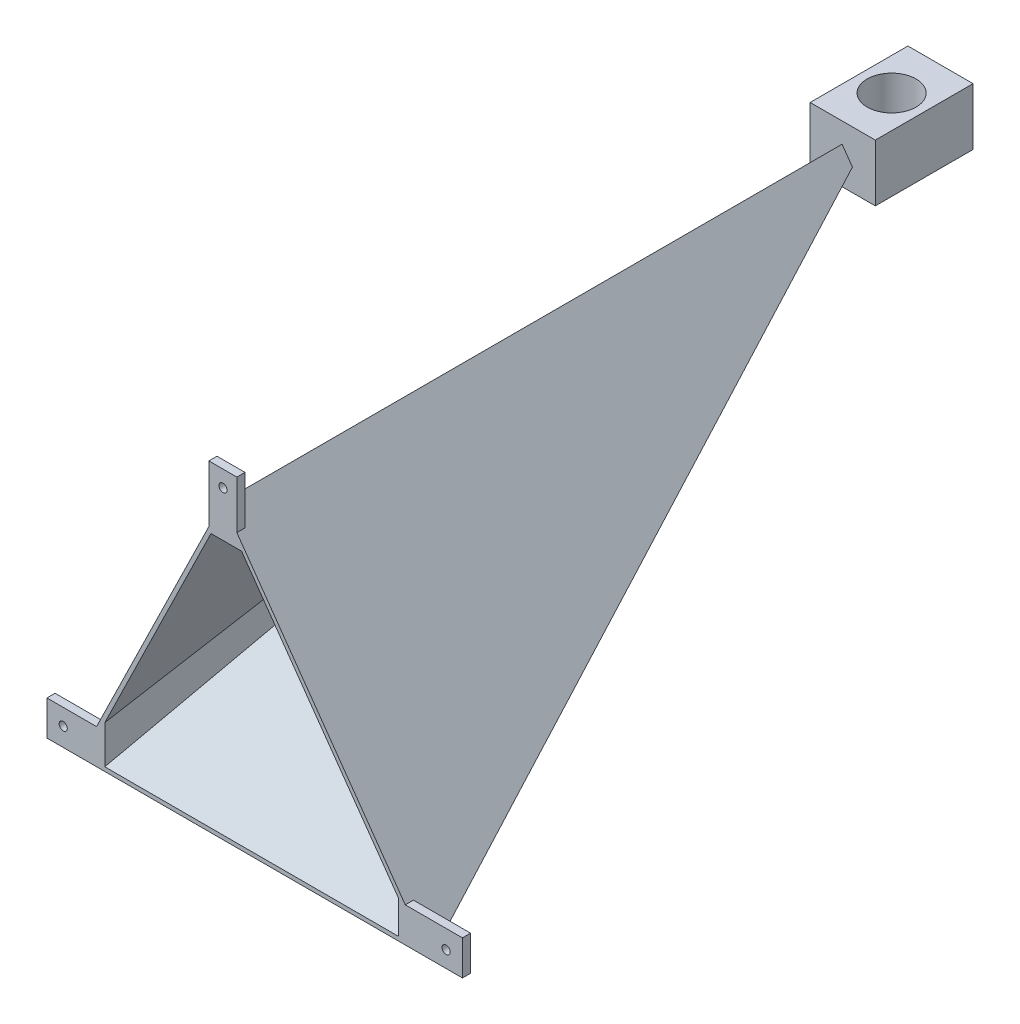
ISO-10303-21;
HEADER;
FILE_DESCRIPTION(('STEP AP214'),'2;1');
FILE_NAME('part.step','',(''),(''),'','','');
FILE_SCHEMA(('AUTOMOTIVE_DESIGN { 1 0 10303 214 1 1 1 1 }'));
ENDSEC;
DATA;
#1=APPLICATION_CONTEXT('core data for automotive mechanical design processes');
#2=APPLICATION_PROTOCOL_DEFINITION('international standard','automotive_design',2000,#1);
#3=PRODUCT_CONTEXT('',#1,'mechanical');
#4=PRODUCT('Part','Part','',(#3));
#5=PRODUCT_RELATED_PRODUCT_CATEGORY('part','',(#4));
#6=PRODUCT_DEFINITION_FORMATION('','',#4);
#7=PRODUCT_DEFINITION_CONTEXT('part definition',#1,'design');
#8=PRODUCT_DEFINITION('design','',#6,#7);
#9=PRODUCT_DEFINITION_SHAPE('','',#8);
#10=(LENGTH_UNIT() NAMED_UNIT(*) SI_UNIT(.MILLI.,.METRE.));
#11=(NAMED_UNIT(*) PLANE_ANGLE_UNIT() SI_UNIT($,.RADIAN.));
#12=(NAMED_UNIT(*) SI_UNIT($,.STERADIAN.) SOLID_ANGLE_UNIT());
#13=UNCERTAINTY_MEASURE_WITH_UNIT(LENGTH_MEASURE(1.E-05),#10,'distance_accuracy_value','');
#14=(GEOMETRIC_REPRESENTATION_CONTEXT(3) GLOBAL_UNCERTAINTY_ASSIGNED_CONTEXT((#13)) GLOBAL_UNIT_ASSIGNED_CONTEXT((#10,
#11,#12)) REPRESENTATION_CONTEXT('',''));
#15=CARTESIAN_POINT('',(0.,0.,0.));
#16=DIRECTION('',(0.,0.,1.));
#17=DIRECTION('',(1.,0.,0.));
#18=AXIS2_PLACEMENT_3D('',#15,#16,#17);
#19=CARTESIAN_POINT('',(-8.76166702832854,4.29092230853839,0.));
#20=DIRECTION('',(0.898083213266033,-0.439825581395349,0.));
#21=DIRECTION('',(0.439825581395349,0.898083213266033,0.));
#22=AXIS2_PLACEMENT_3D('',#19,#20,#21);
#23=PLANE('',#22);
#24=DIRECTION('',(-0.439825581395349,-0.898083213266033,0.));
#25=VECTOR('',#24,1.);
#26=CARTESIAN_POINT('',(77.1020210409745,179.616642653207,0.));
#27=LINE('',#26,#25);
#28=CARTESIAN_POINT('',(68.5139513556418,162.080597582142,0.));
#29=VERTEX_POINT('',#28);
#30=CARTESIAN_POINT('',(-0.414869497190093,21.3343119255414,0.));
#31=VERTEX_POINT('',#30);
#32=EDGE_CURVE('E306',#29,#31,#27,.T.);
#33=ORIENTED_EDGE('',*,*,#32,.F.);
#34=DIRECTION('',(0.,0.,-1.));
#35=VECTOR('',#34,1.);
#36=CARTESIAN_POINT('',(68.5139513556418,162.080597582142,0.));
#37=LINE('',#36,#35);
#38=CARTESIAN_POINT('',(68.5139513556418,162.080597582142,-5.));
#39=VERTEX_POINT('',#38);
#40=EDGE_CURVE('E417',#29,#39,#37,.T.);
#41=ORIENTED_EDGE('',*,*,#40,.T.);
#42=DIRECTION('',(-0.439825581395349,-0.898083213266033,0.));
#43=VECTOR('',#42,1.);
#44=CARTESIAN_POINT('',(-8.76166702832854,4.29092230853839,-5.));
#45=LINE('',#44,#43);
#46=CARTESIAN_POINT('',(77.1020210409745,179.616642653207,-5.));
#47=VERTEX_POINT('',#46);
#48=EDGE_CURVE('E416',#47,#39,#45,.T.);
#49=ORIENTED_EDGE('',*,*,#48,.F.);
#50=DIRECTION('',(0.,0.,1.));
#51=VECTOR('',#50,1.);
#52=CARTESIAN_POINT('',(77.1020210409745,179.616642653207,-399.999999999999));
#53=LINE('',#52,#51);
#54=CARTESIAN_POINT('',(77.1020210409745,179.616642653207,-379.999999999999));
#55=VERTEX_POINT('',#54);
#56=EDGE_CURVE('E335',#55,#47,#53,.T.);
#57=ORIENTED_EDGE('',*,*,#56,.F.);
#58=DIRECTION('',(0.439825581395349,0.898083213266033,0.));
#59=VECTOR('',#58,1.);
#60=CARTESIAN_POINT('',(-8.76166702832853,4.29092230853838,-379.999999999999));
#61=LINE('',#60,#59);
#62=CARTESIAN_POINT('',(72.703765227021,170.635810520546,-379.999999999999));
#63=VERTEX_POINT('',#62);
#64=EDGE_CURVE('E384',#63,#55,#61,.T.);
#65=ORIENTED_EDGE('',*,*,#64,.F.);
#66=DIRECTION('',(-0.196695979648674,-0.401635022862859,0.894427190999915));
#67=VECTOR('',#66,1.);
#68=CARTESIAN_POINT('',(77.1020210409745,179.616642653207,-399.999999999999));
#69=LINE('',#68,#67);
#70=CARTESIAN_POINT('',(-9.76353128460688,2.24520803316507,-4.99999999999995));
#71=VERTEX_POINT('',#70);
#72=EDGE_CURVE('E331',#63,#71,#69,.T.);
#73=ORIENTED_EDGE('',*,*,#72,.T.);
#74=DIRECTION('',(0.439825581395349,0.898083213266033,0.));
#75=VECTOR('',#74,1.);
#76=CARTESIAN_POINT('',(-8.76166702832854,4.29092230853839,-5.));
#77=LINE('',#76,#75);
#78=CARTESIAN_POINT('',(-0.414869497190087,21.3343119255414,-5.));
#79=VERTEX_POINT('',#78);
#80=EDGE_CURVE('E517',#71,#79,#77,.T.);
#81=ORIENTED_EDGE('',*,*,#80,.T.);
#82=DIRECTION('',(0.,0.,1.));
#83=VECTOR('',#82,1.);
#84=CARTESIAN_POINT('',(-0.414869497190088,21.3343119255414,0.));
#85=LINE('',#84,#83);
#86=EDGE_CURVE('E368',#79,#31,#85,.T.);
#87=ORIENTED_EDGE('',*,*,#86,.T.);
#88=EDGE_LOOP('',(#33,#41,#49,#57,#65,#73,#81,#87));
#89=FACE_BOUND('',#88,.T.);
#90=ADVANCED_FACE('F55',(#89),#23,.F.);
#91=CARTESIAN_POINT('',(136.072170604111,96.2378102329994,0.));
#92=DIRECTION('',(-0.816439284787303,-0.577431289640592,0.));
#93=DIRECTION('',(0.577431289640592,-0.816439284787303,0.));
#94=AXIS2_PLACEMENT_3D('',#91,#92,#93);
#95=PLANE('',#94);
#96=DIRECTION('',(-0.577431289640592,0.816439284787303,0.));
#97=VECTOR('',#96,1.);
#98=CARTESIAN_POINT('',(136.072170604111,96.2378102329994,-5.));
#99=LINE('',#98,#97);
#100=CARTESIAN_POINT('',(85.6900907263073,167.47383432711,-5.));
#101=VERTEX_POINT('',#100);
#102=EDGE_CURVE('E314',#101,#47,#99,.T.);
#103=ORIENTED_EDGE('',*,*,#102,.F.);
#104=DIRECTION('',(0.,0.,1.));
#105=VECTOR('',#104,1.);
#106=CARTESIAN_POINT('',(85.6900907263073,167.47383432711,0.));
#107=LINE('',#106,#105);
#108=CARTESIAN_POINT('',(85.6900907263073,167.47383432711,0.));
#109=VERTEX_POINT('',#108);
#110=EDGE_CURVE('E402',#101,#109,#107,.T.);
#111=ORIENTED_EDGE('',*,*,#110,.T.);
#112=DIRECTION('',(-0.577431289640592,0.816439284787303,0.));
#113=VECTOR('',#112,1.);
#114=CARTESIAN_POINT('',(204.136904761905,0.,0.));
#115=LINE('',#114,#113);
#116=CARTESIAN_POINT('',(189.04809230726,21.3343119255414,0.));
#117=VERTEX_POINT('',#116);
#118=EDGE_CURVE('E336',#117,#109,#115,.T.);
#119=ORIENTED_EDGE('',*,*,#118,.F.);
#120=DIRECTION('',(0.,0.,-1.));
#121=VECTOR('',#120,1.);
#122=CARTESIAN_POINT('',(189.04809230726,21.3343119255414,0.));
#123=LINE('',#122,#121);
#124=CARTESIAN_POINT('',(189.04809230726,21.3343119255414,-5.));
#125=VERTEX_POINT('',#124);
#126=EDGE_CURVE('E486',#117,#125,#123,.T.);
#127=ORIENTED_EDGE('',*,*,#126,.T.);
#128=DIRECTION('',(-0.577431289640592,0.816439284787303,0.));
#129=VECTOR('',#128,1.);
#130=CARTESIAN_POINT('',(136.072170604111,96.2378102329994,-5.));
#131=LINE('',#130,#129);
#132=CARTESIAN_POINT('',(202.548968715393,2.24520803316507,-4.99999999999998));
#133=VERTEX_POINT('',#132);
#134=EDGE_CURVE('E494',#133,#125,#131,.T.);
#135=ORIENTED_EDGE('',*,*,#134,.F.);
#136=DIRECTION('',(0.278274965182918,-0.393457399389571,0.876215908676646));
#137=VECTOR('',#136,1.);
#138=CARTESIAN_POINT('',(77.1020210409745,179.616642653207,-399.999999999999));
#139=LINE('',#138,#137);
#140=CARTESIAN_POINT('',(83.4537652270211,170.635810520546,-379.999999999999));
#141=VERTEX_POINT('',#140);
#142=EDGE_CURVE('E293',#141,#133,#139,.T.);
#143=ORIENTED_EDGE('',*,*,#142,.F.);
#144=DIRECTION('',(0.577431289640592,-0.816439284787303,0.));
#145=VECTOR('',#144,1.);
#146=CARTESIAN_POINT('',(136.072170604111,96.2378102329994,-379.999999999999));
#147=LINE('',#146,#145);
#148=EDGE_CURVE('E571',#55,#141,#147,.T.);
#149=ORIENTED_EDGE('',*,*,#148,.F.);
#150=ORIENTED_EDGE('',*,*,#56,.T.);
#151=EDGE_LOOP('',(#103,#111,#119,#127,#135,#143,#149,#150));
#152=FACE_BOUND('',#151,.T.);
#153=ADVANCED_FACE('F387',(#152),#95,.F.);
#154=CARTESIAN_POINT('',(0.,0.,0.));
#155=DIRECTION('',(0.,0.91224839351879,0.409637484274067));
#156=DIRECTION('',(0.,-0.409637484274067,0.91224839351879));
#157=AXIS2_PLACEMENT_3D('',#154,#155,#156);
#158=PLANE('',#157);
#159=DIRECTION('',(1.,0.,0.));
#160=VECTOR('',#159,1.);
#161=CARTESIAN_POINT('',(0.,2.24520803316509,-5.));
#162=LINE('',#161,#160);
#163=CARTESIAN_POINT('',(174.136904761905,2.24520803316508,-5.));
#164=VERTEX_POINT('',#163);
#165=EDGE_CURVE('E356',#164,#133,#162,.T.);
#166=ORIENTED_EDGE('',*,*,#165,.F.);
#167=DIRECTION('',(0.,-0.409637484274067,0.91224839351879));
#168=VECTOR('',#167,1.);
#169=CARTESIAN_POINT('',(174.136904761905,0.,0.));
#170=LINE('',#169,#168);
#171=CARTESIAN_POINT('',(174.136904761905,0.,0.));
#172=VERTEX_POINT('',#171);
#173=EDGE_CURVE('E489',#164,#172,#170,.T.);
#174=ORIENTED_EDGE('',*,*,#173,.T.);
#175=DIRECTION('',(1.,0.,0.));
#176=VECTOR('',#175,1.);
#177=CARTESIAN_POINT('',(-10.8630952380952,0.,0.));
#178=LINE('',#177,#176);
#179=CARTESIAN_POINT('',(19.1369047619048,0.,0.));
#180=VERTEX_POINT('',#179);
#181=EDGE_CURVE('E349',#180,#172,#178,.T.);
#182=ORIENTED_EDGE('',*,*,#181,.F.);
#183=DIRECTION('',(0.,0.409637484274067,-0.91224839351879));
#184=VECTOR('',#183,1.);
#185=CARTESIAN_POINT('',(19.1369047619048,0.,0.));
#186=LINE('',#185,#184);
#187=CARTESIAN_POINT('',(19.1369047619048,2.24520803316508,-5.));
#188=VERTEX_POINT('',#187);
#189=EDGE_CURVE('E512',#180,#188,#186,.T.);
#190=ORIENTED_EDGE('',*,*,#189,.T.);
#191=DIRECTION('',(-1.,0.,0.));
#192=VECTOR('',#191,1.);
#193=CARTESIAN_POINT('',(0.,2.24520803316509,-5.));
#194=LINE('',#193,#192);
#195=EDGE_CURVE('E341',#188,#71,#194,.T.);
#196=ORIENTED_EDGE('',*,*,#195,.T.);
#197=ORIENTED_EDGE('',*,*,#72,.F.);
#198=DIRECTION('',(-1.,0.,0.));
#199=VECTOR('',#198,1.);
#200=CARTESIAN_POINT('',(0.,170.635810520546,-379.999999999999));
#201=LINE('',#200,#199);
#202=EDGE_CURVE('E337',#141,#63,#201,.T.);
#203=ORIENTED_EDGE('',*,*,#202,.F.);
#204=ORIENTED_EDGE('',*,*,#142,.T.);
#205=EDGE_LOOP('',(#166,#174,#182,#190,#196,#197,#203,#204));
#206=FACE_BOUND('',#205,.T.);
#207=ADVANCED_FACE('F57',(#206),#158,.F.);
#208=CARTESIAN_POINT('',(0.,0.,0.));
#209=DIRECTION('',(0.,0.,1.));
#210=DIRECTION('',(1.,0.,0.));
#211=AXIS2_PLACEMENT_3D('',#208,#209,#210);
#212=PLANE('',#211);
#213=DIRECTION('',(-1.,0.,0.));
#214=VECTOR('',#213,1.);
#215=CARTESIAN_POINT('',(88.5716986076385,159.069963659325,0.));
#216=LINE('',#215,#214);
#217=CARTESIAN_POINT('',(88.5716986076385,159.069963659325,0.));
#218=VERTEX_POINT('',#217);
#219=CARTESIAN_POINT('',(69.8232355813792,159.069963659325,0.));
#220=VERTEX_POINT('',#219);
#221=EDGE_CURVE('E682',#218,#220,#216,.T.);
#222=ORIENTED_EDGE('',*,*,#221,.F.);
#223=DIRECTION('',(-0.577431289640592,0.816439284787303,0.));
#224=VECTOR('',#223,1.);
#225=CARTESIAN_POINT('',(184.871981238866,22.9094623377017,0.));
#226=LINE('',#225,#224);
#227=CARTESIAN_POINT('',(184.871981238866,22.9094623377017,0.));
#228=VERTEX_POINT('',#227);
#229=EDGE_CURVE('E677',#228,#218,#226,.T.);
#230=ORIENTED_EDGE('',*,*,#229,.F.);
#231=DIRECTION('',(0.,1.,0.));
#232=VECTOR('',#231,1.);
#233=CARTESIAN_POINT('',(184.871981238866,2.5,0.));
#234=LINE('',#233,#232);
#235=CARTESIAN_POINT('',(184.871981238866,2.5,0.));
#236=VERTEX_POINT('',#235);
#237=EDGE_CURVE('E255',#236,#228,#234,.T.);
#238=ORIENTED_EDGE('',*,*,#237,.F.);
#239=DIRECTION('',(1.,0.,0.));
#240=VECTOR('',#239,1.);
#241=CARTESIAN_POINT('',(4.64946483043279,2.5,0.));
#242=LINE('',#241,#240);
#243=CARTESIAN_POINT('',(4.64946483043279,2.5,0.));
#244=VERTEX_POINT('',#243);
#245=EDGE_CURVE('E232',#244,#236,#242,.T.);
#246=ORIENTED_EDGE('',*,*,#245,.F.);
#247=DIRECTION('',(0.,-1.,0.));
#248=VECTOR('',#247,1.);
#249=CARTESIAN_POINT('',(4.64946483043279,2.5,0.));
#250=LINE('',#249,#248);
#251=CARTESIAN_POINT('',(4.64946483043279,25.9911434802389,0.));
#252=VERTEX_POINT('',#251);
#253=EDGE_CURVE('E242',#252,#244,#250,.T.);
#254=ORIENTED_EDGE('',*,*,#253,.F.);
#255=DIRECTION('',(-0.439825581395349,-0.898083213266033,0.));
#256=VECTOR('',#255,1.);
#257=CARTESIAN_POINT('',(4.64946483043279,25.9911434802389,0.));
#258=LINE('',#257,#256);
#259=EDGE_CURVE('E247',#220,#252,#258,.T.);
#260=ORIENTED_EDGE('',*,*,#259,.F.);
#261=EDGE_LOOP('',(#222,#230,#238,#246,#254,#260));
#262=FACE_BOUND('',#261,.T.);
#263=CARTESIAN_POINT('',(-20.8630952380952,11.3343119255414,0.));
#264=DIRECTION('',(0.,0.,1.));
#265=DIRECTION('',(1.,0.,0.));
#266=AXIS2_PLACEMENT_3D('',#263,#264,#265);
#267=CIRCLE('',#266,2.5);
#268=CARTESIAN_POINT('',(-18.3630952380952,11.3343119255414,0.));
#269=VERTEX_POINT('',#268);
#270=EDGE_CURVE('E657',#269,#269,#267,.T.);
#271=ORIENTED_EDGE('',*,*,#270,.F.);
#272=EDGE_LOOP('',(#271));
#273=FACE_BOUND('',#272,.T.);
#274=CARTESIAN_POINT('',(214.136904761905,10.,0.));
#275=DIRECTION('',(0.,0.,1.));
#276=DIRECTION('',(1.,0.,0.));
#277=AXIS2_PLACEMENT_3D('',#274,#275,#276);
#278=CIRCLE('',#277,2.5);
#279=CARTESIAN_POINT('',(216.636904761905,10.,0.));
#280=VERTEX_POINT('',#279);
#281=EDGE_CURVE('E662',#280,#280,#278,.T.);
#282=ORIENTED_EDGE('',*,*,#281,.F.);
#283=EDGE_LOOP('',(#282));
#284=FACE_BOUND('',#283,.T.);
#285=CARTESIAN_POINT('',(77.1900907263073,187.,0.));
#286=DIRECTION('',(0.,0.,1.));
#287=DIRECTION('',(1.,0.,0.));
#288=AXIS2_PLACEMENT_3D('',#285,#286,#287);
#289=CIRCLE('',#288,2.5);
#290=CARTESIAN_POINT('',(79.6900907263073,187.,0.));
#291=VERTEX_POINT('',#290);
#292=EDGE_CURVE('E450',#291,#291,#289,.T.);
#293=ORIENTED_EDGE('',*,*,#292,.F.);
#294=EDGE_LOOP('',(#293));
#295=FACE_BOUND('',#294,.T.);
#296=ORIENTED_EDGE('',*,*,#118,.T.);
#297=DIRECTION('',(0.,1.,0.));
#298=VECTOR('',#297,1.);
#299=CARTESIAN_POINT('',(85.6900907263073,157.,0.));
#300=LINE('',#299,#298);
#301=CARTESIAN_POINT('',(85.6900907263073,197.,0.));
#302=VERTEX_POINT('',#301);
#303=EDGE_CURVE('E414',#109,#302,#300,.T.);
#304=ORIENTED_EDGE('',*,*,#303,.T.);
#305=DIRECTION('',(-1.,0.,0.));
#306=VECTOR('',#305,1.);
#307=CARTESIAN_POINT('',(68.5139513556417,197.,0.));
#308=LINE('',#307,#306);
#309=CARTESIAN_POINT('',(68.5139513556417,197.,0.));
#310=VERTEX_POINT('',#309);
#311=EDGE_CURVE('E440',#302,#310,#308,.T.);
#312=ORIENTED_EDGE('',*,*,#311,.T.);
#313=DIRECTION('',(0.,-1.,0.));
#314=VECTOR('',#313,1.);
#315=CARTESIAN_POINT('',(68.5139513556418,157.,0.));
#316=LINE('',#315,#314);
#317=EDGE_CURVE('E428',#310,#29,#316,.T.);
#318=ORIENTED_EDGE('',*,*,#317,.T.);
#319=ORIENTED_EDGE('',*,*,#32,.T.);
#320=DIRECTION('',(-1.,0.,0.));
#321=VECTOR('',#320,1.);
#322=CARTESIAN_POINT('',(19.1369047619048,21.3343119255414,0.));
#323=LINE('',#322,#321);
#324=CARTESIAN_POINT('',(-30.8630952380952,21.3343119255414,0.));
#325=VERTEX_POINT('',#324);
#326=EDGE_CURVE('E360',#31,#325,#323,.T.);
#327=ORIENTED_EDGE('',*,*,#326,.T.);
#328=DIRECTION('',(0.,-1.,0.));
#329=VECTOR('',#328,1.);
#330=CARTESIAN_POINT('',(-30.8630952380952,0.,0.));
#331=LINE('',#330,#329);
#332=CARTESIAN_POINT('',(-30.8630952380952,0.,0.));
#333=VERTEX_POINT('',#332);
#334=EDGE_CURVE('E503',#325,#333,#331,.T.);
#335=ORIENTED_EDGE('',*,*,#334,.T.);
#336=DIRECTION('',(1.,0.,0.));
#337=VECTOR('',#336,1.);
#338=CARTESIAN_POINT('',(19.1369047619048,0.,0.));
#339=LINE('',#338,#337);
#340=EDGE_CURVE('E357',#333,#180,#339,.T.);
#341=ORIENTED_EDGE('',*,*,#340,.T.);
#342=ORIENTED_EDGE('',*,*,#181,.T.);
#343=DIRECTION('',(1.,0.,0.));
#344=VECTOR('',#343,1.);
#345=CARTESIAN_POINT('',(174.136904761905,0.,0.));
#346=LINE('',#345,#344);
#347=CARTESIAN_POINT('',(224.136904761905,0.,0.));
#348=VERTEX_POINT('',#347);
#349=EDGE_CURVE('E475',#172,#348,#346,.T.);
#350=ORIENTED_EDGE('',*,*,#349,.T.);
#351=DIRECTION('',(0.,1.,0.));
#352=VECTOR('',#351,1.);
#353=CARTESIAN_POINT('',(224.136904761905,0.,0.));
#354=LINE('',#353,#352);
#355=CARTESIAN_POINT('',(224.136904761905,21.3343119255414,0.));
#356=VERTEX_POINT('',#355);
#357=EDGE_CURVE('E471',#348,#356,#354,.T.);
#358=ORIENTED_EDGE('',*,*,#357,.T.);
#359=DIRECTION('',(-1.,0.,0.));
#360=VECTOR('',#359,1.);
#361=CARTESIAN_POINT('',(174.136904761905,21.3343119255414,0.));
#362=LINE('',#361,#360);
#363=EDGE_CURVE('E474',#356,#117,#362,.T.);
#364=ORIENTED_EDGE('',*,*,#363,.T.);
#365=EDGE_LOOP('',(#296,#304,#312,#318,#319,#327,#335,#341,#342,#350,#358,#364));
#366=FACE_BOUND('',#365,.T.);
#367=ADVANCED_FACE('F252',(#262,#273,#284,#295,#366),#212,.T.);
#368=CARTESIAN_POINT('',(0.,0.,-379.999999999999));
#369=DIRECTION('',(0.,0.,-1.));
#370=DIRECTION('',(-1.,0.,0.));
#371=AXIS2_PLACEMENT_3D('',#368,#369,#370);
#372=PLANE('',#371);
#373=DIRECTION('',(0.,1.,0.));
#374=VECTOR('',#373,1.);
#375=CARTESIAN_POINT('',(57.5,192.,-379.999999999999));
#376=LINE('',#375,#374);
#377=CARTESIAN_POINT('',(57.5,157.,-379.999999999999));
#378=VERTEX_POINT('',#377);
#379=CARTESIAN_POINT('',(57.5,192.,-379.999999999999));
#380=VERTEX_POINT('',#379);
#381=EDGE_CURVE('E527',#378,#380,#376,.T.);
#382=ORIENTED_EDGE('',*,*,#381,.F.);
#383=DIRECTION('',(-1.,0.,0.));
#384=VECTOR('',#383,1.);
#385=CARTESIAN_POINT('',(97.5,157.,-379.999999999999));
#386=LINE('',#385,#384);
#387=CARTESIAN_POINT('',(97.5,157.,-379.999999999999));
#388=VERTEX_POINT('',#387);
#389=EDGE_CURVE('E536',#388,#378,#386,.T.);
#390=ORIENTED_EDGE('',*,*,#389,.F.);
#391=DIRECTION('',(0.,-1.,0.));
#392=VECTOR('',#391,1.);
#393=CARTESIAN_POINT('',(97.5,192.,-379.999999999999));
#394=LINE('',#393,#392);
#395=CARTESIAN_POINT('',(97.5,192.,-379.999999999999));
#396=VERTEX_POINT('',#395);
#397=EDGE_CURVE('E552',#396,#388,#394,.T.);
#398=ORIENTED_EDGE('',*,*,#397,.F.);
#399=DIRECTION('',(1.,0.,0.));
#400=VECTOR('',#399,1.);
#401=CARTESIAN_POINT('',(97.5,192.,-379.999999999999));
#402=LINE('',#401,#400);
#403=EDGE_CURVE('E549',#380,#396,#402,.T.);
#404=ORIENTED_EDGE('',*,*,#403,.F.);
#405=EDGE_LOOP('',(#382,#390,#398,#404));
#406=FACE_BOUND('',#405,.T.);
#407=ORIENTED_EDGE('',*,*,#202,.T.);
#408=ORIENTED_EDGE('',*,*,#64,.T.);
#409=ORIENTED_EDGE('',*,*,#148,.T.);
#410=EDGE_LOOP('',(#407,#408,#409));
#411=FACE_BOUND('',#410,.T.);
#412=ADVANCED_FACE('F274',(#406,#411),#372,.F.);
#413=CARTESIAN_POINT('',(57.5,192.,-439.999999999999));
#414=DIRECTION('',(1.,0.,0.));
#415=DIRECTION('',(0.,1.,0.));
#416=AXIS2_PLACEMENT_3D('',#413,#414,#415);
#417=PLANE('',#416);
#418=ORIENTED_EDGE('',*,*,#381,.T.);
#419=DIRECTION('',(0.,0.,1.));
#420=VECTOR('',#419,1.);
#421=CARTESIAN_POINT('',(57.5,192.,-439.999999999999));
#422=LINE('',#421,#420);
#423=CARTESIAN_POINT('',(57.5,192.,-439.999999999999));
#424=VERTEX_POINT('',#423);
#425=EDGE_CURVE('E568',#424,#380,#422,.T.);
#426=ORIENTED_EDGE('',*,*,#425,.F.);
#427=DIRECTION('',(0.,1.,0.));
#428=VECTOR('',#427,1.);
#429=CARTESIAN_POINT('',(57.5,192.,-439.999999999999));
#430=LINE('',#429,#428);
#431=CARTESIAN_POINT('',(57.5,157.,-439.999999999999));
#432=VERTEX_POINT('',#431);
#433=EDGE_CURVE('E531',#432,#424,#430,.T.);
#434=ORIENTED_EDGE('',*,*,#433,.F.);
#435=DIRECTION('',(0.,0.,1.));
#436=VECTOR('',#435,1.);
#437=CARTESIAN_POINT('',(57.5,157.,-439.999999999999));
#438=LINE('',#437,#436);
#439=EDGE_CURVE('E545',#432,#378,#438,.T.);
#440=ORIENTED_EDGE('',*,*,#439,.T.);
#441=EDGE_LOOP('',(#418,#426,#434,#440));
#442=FACE_BOUND('',#441,.T.);
#443=ADVANCED_FACE('F275',(#442),#417,.F.);
#444=CARTESIAN_POINT('',(97.5,192.,-439.999999999999));
#445=DIRECTION('',(0.,-1.,0.));
#446=DIRECTION('',(0.,0.,-1.));
#447=AXIS2_PLACEMENT_3D('',#444,#445,#446);
#448=PLANE('',#447);
#449=CARTESIAN_POINT('',(77.5,192.,-409.999999999999));
#450=DIRECTION('',(0.,1.,0.));
#451=DIRECTION('',(0.,0.,1.));
#452=AXIS2_PLACEMENT_3D('',#449,#450,#451);
#453=CIRCLE('',#452,15.);
#454=CARTESIAN_POINT('',(77.5,192.,-394.999999999999));
#455=VERTEX_POINT('',#454);
#456=EDGE_CURVE('E522',#455,#455,#453,.T.);
#457=ORIENTED_EDGE('',*,*,#456,.F.);
#458=EDGE_LOOP('',(#457));
#459=FACE_BOUND('',#458,.T.);
#460=ORIENTED_EDGE('',*,*,#403,.T.);
#461=DIRECTION('',(0.,0.,1.));
#462=VECTOR('',#461,1.);
#463=CARTESIAN_POINT('',(97.5,192.,-439.999999999999));
#464=LINE('',#463,#462);
#465=CARTESIAN_POINT('',(97.5,192.,-439.999999999999));
#466=VERTEX_POINT('',#465);
#467=EDGE_CURVE('E564',#466,#396,#464,.T.);
#468=ORIENTED_EDGE('',*,*,#467,.F.);
#469=DIRECTION('',(1.,0.,0.));
#470=VECTOR('',#469,1.);
#471=CARTESIAN_POINT('',(97.5,192.,-439.999999999999));
#472=LINE('',#471,#470);
#473=EDGE_CURVE('E535',#424,#466,#472,.T.);
#474=ORIENTED_EDGE('',*,*,#473,.F.);
#475=ORIENTED_EDGE('',*,*,#425,.T.);
#476=EDGE_LOOP('',(#460,#468,#474,#475));
#477=FACE_BOUND('',#476,.T.);
#478=ADVANCED_FACE('F810',(#459,#477),#448,.F.);
#479=CARTESIAN_POINT('',(97.5,192.,-439.999999999999));
#480=DIRECTION('',(-1.,0.,0.));
#481=DIRECTION('',(0.,0.,1.));
#482=AXIS2_PLACEMENT_3D('',#479,#480,#481);
#483=PLANE('',#482);
#484=ORIENTED_EDGE('',*,*,#397,.T.);
#485=DIRECTION('',(0.,0.,1.));
#486=VECTOR('',#485,1.);
#487=CARTESIAN_POINT('',(97.5,157.,-439.999999999999));
#488=LINE('',#487,#486);
#489=CARTESIAN_POINT('',(97.5,157.,-439.999999999999));
#490=VERTEX_POINT('',#489);
#491=EDGE_CURVE('E560',#490,#388,#488,.T.);
#492=ORIENTED_EDGE('',*,*,#491,.F.);
#493=DIRECTION('',(0.,-1.,0.));
#494=VECTOR('',#493,1.);
#495=CARTESIAN_POINT('',(97.5,192.,-439.999999999999));
#496=LINE('',#495,#494);
#497=EDGE_CURVE('E539',#466,#490,#496,.T.);
#498=ORIENTED_EDGE('',*,*,#497,.F.);
#499=ORIENTED_EDGE('',*,*,#467,.T.);
#500=EDGE_LOOP('',(#484,#492,#498,#499));
#501=FACE_BOUND('',#500,.T.);
#502=ADVANCED_FACE('F807',(#501),#483,.F.);
#503=CARTESIAN_POINT('',(97.5,157.,-439.999999999999));
#504=DIRECTION('',(0.,1.,0.));
#505=DIRECTION('',(0.,0.,1.));
#506=AXIS2_PLACEMENT_3D('',#503,#504,#505);
#507=PLANE('',#506);
#508=CARTESIAN_POINT('',(77.5,157.,-409.999999999999));
#509=DIRECTION('',(0.,-1.,0.));
#510=DIRECTION('',(0.,0.,-1.));
#511=AXIS2_PLACEMENT_3D('',#508,#509,#510);
#512=CIRCLE('',#511,2.5);
#513=CARTESIAN_POINT('',(77.5,157.,-412.499999999999));
#514=VERTEX_POINT('',#513);
#515=EDGE_CURVE('E1060',#514,#514,#512,.T.);
#516=ORIENTED_EDGE('',*,*,#515,.F.);
#517=EDGE_LOOP('',(#516));
#518=FACE_BOUND('',#517,.T.);
#519=ORIENTED_EDGE('',*,*,#389,.T.);
#520=ORIENTED_EDGE('',*,*,#439,.F.);
#521=DIRECTION('',(-1.,0.,0.));
#522=VECTOR('',#521,1.);
#523=CARTESIAN_POINT('',(97.5,157.,-439.999999999999));
#524=LINE('',#523,#522);
#525=EDGE_CURVE('E542',#490,#432,#524,.T.);
#526=ORIENTED_EDGE('',*,*,#525,.F.);
#527=ORIENTED_EDGE('',*,*,#491,.T.);
#528=EDGE_LOOP('',(#519,#520,#526,#527));
#529=FACE_BOUND('',#528,.T.);
#530=ADVANCED_FACE('F800',(#518,#529),#507,.F.);
#531=CARTESIAN_POINT('',(0.,0.,-439.999999999999));
#532=DIRECTION('',(0.,0.,-1.));
#533=DIRECTION('',(-1.,0.,0.));
#534=AXIS2_PLACEMENT_3D('',#531,#532,#533);
#535=PLANE('',#534);
#536=ORIENTED_EDGE('',*,*,#433,.T.);
#537=ORIENTED_EDGE('',*,*,#473,.T.);
#538=ORIENTED_EDGE('',*,*,#497,.T.);
#539=ORIENTED_EDGE('',*,*,#525,.T.);
#540=EDGE_LOOP('',(#536,#537,#538,#539));
#541=FACE_BOUND('',#540,.T.);
#542=ADVANCED_FACE('F797',(#541),#535,.T.);
#543=CARTESIAN_POINT('',(77.5,162.,-409.999999999999));
#544=DIRECTION('',(0.,1.,0.));
#545=DIRECTION('',(0.,0.,1.));
#546=AXIS2_PLACEMENT_3D('',#543,#544,#545);
#547=CYLINDRICAL_SURFACE('',#546,15.);
#548=CARTESIAN_POINT('',(77.5,179.162171859235,-409.999999999999));
#549=DIRECTION('',(0.816423339174677,0.577420012016114,0.0062498779332638));
#550=DIRECTION('',(-0.577403093783345,0.816447260833981,-0.00442013191107791));
#551=AXIS2_PLACEMENT_3D('',#548,#549,#550);
#552=ELLIPSE('',#551,25.9776240654115,15.);
#553=CARTESIAN_POINT('',(78.4411822626368,177.66938222322,-395.029556588112));
#554=VERTEX_POINT('',#553);
#555=CARTESIAN_POINT('',(77.2453300155404,179.359920223109,-395.00216204918));
#556=VERTEX_POINT('',#555);
#557=EDGE_CURVE('E640',#554,#556,#552,.F.);
#558=ORIENTED_EDGE('',*,*,#557,.T.);
#559=CARTESIAN_POINT('',(77.5,180.130309628054,-409.999999999999));
#560=DIRECTION('',(0.,0.99868333617288,0.0512990648122067));
#561=DIRECTION('',(0.,0.0512990648122067,-0.99868333617288));
#562=AXIS2_PLACEMENT_3D('',#559,#560,#561);
#563=ELLIPSE('',#562,15.0197759957451,15.);
#564=CARTESIAN_POINT('',(77.0111811962979,179.36021839963,-395.007966909816));
#565=VERTEX_POINT('',#564);
#566=EDGE_CURVE('E12',#556,#565,#563,.F.);
#567=ORIENTED_EDGE('',*,*,#566,.T.);
#568=CARTESIAN_POINT('',(77.5,180.571380713239,-409.999999999999));
#569=DIRECTION('',(-0.898065673092145,0.439816991303624,0.00624987793326368));
#570=DIRECTION('',(0.439806341217739,0.898087420110441,-0.00306072933109887));
#571=AXIS2_PLACEMENT_3D('',#568,#569,#570);
#572=ELLIPSE('',#571,34.1050943837794,15.);
#573=CARTESIAN_POINT('',(76.2064851244617,177.717784153283,-395.055876764868));
#574=VERTEX_POINT('',#573);
#575=EDGE_CURVE('E66',#565,#574,#572,.F.);
#576=ORIENTED_EDGE('',*,*,#575,.T.);
#577=DIRECTION('',(0.,1.,0.));
#578=VECTOR('',#577,1.);
#579=CARTESIAN_POINT('',(76.2064851244617,162.,-395.055876764868));
#580=LINE('',#579,#578);
#581=CARTESIAN_POINT('',(76.2064851244617,177.427426382532,-395.055876764868));
#582=VERTEX_POINT('',#581);
#583=EDGE_CURVE('E408',#574,#582,#580,.F.);
#584=ORIENTED_EDGE('',*,*,#583,.T.);
#585=CARTESIAN_POINT('',(77.5,184.044558719537,-409.999999999999));
#586=DIRECTION('',(0.,-0.914371574945137,-0.40487605872952));
#587=DIRECTION('',(0.,0.40487605872952,-0.914371574945137));
#588=AXIS2_PLACEMENT_3D('',#585,#586,#587);
#589=ELLIPSE('',#588,16.4047094321584,15.);
#590=CARTESIAN_POINT('',(78.4411822626368,177.415772029179,-395.029556588112));
#591=VERTEX_POINT('',#590);
#592=EDGE_CURVE('E236',#582,#591,#589,.F.);
#593=ORIENTED_EDGE('',*,*,#592,.T.);
#594=DIRECTION('',(0.,1.,0.));
#595=VECTOR('',#594,1.);
#596=CARTESIAN_POINT('',(78.4411822626368,162.,-395.029556588112));
#597=LINE('',#596,#595);
#598=EDGE_CURVE('E636',#591,#554,#597,.T.);
#599=ORIENTED_EDGE('',*,*,#598,.T.);
#600=EDGE_LOOP('',(#558,#567,#576,#584,#593,#599));
#601=FACE_BOUND('',#600,.T.);
#602=CARTESIAN_POINT('',(77.5,162.,-409.999999999999));
#603=DIRECTION('',(0.,1.,0.));
#604=DIRECTION('',(0.,0.,1.));
#605=AXIS2_PLACEMENT_3D('',#602,#603,#604);
#606=CIRCLE('',#605,15.);
#607=CARTESIAN_POINT('',(77.5,162.,-394.999999999999));
#608=VERTEX_POINT('',#607);
#609=EDGE_CURVE('E523',#608,#608,#606,.T.);
#610=ORIENTED_EDGE('',*,*,#609,.F.);
#611=EDGE_LOOP('',(#610));
#612=FACE_BOUND('',#611,.T.);
#613=ORIENTED_EDGE('',*,*,#456,.T.);
#614=EDGE_LOOP('',(#613));
#615=FACE_BOUND('',#614,.T.);
#616=ADVANCED_FACE('F793',(#601,#612,#615),#547,.F.);
#617=CARTESIAN_POINT('',(77.5,162.,-409.999999999999));
#618=DIRECTION('',(0.,1.,0.));
#619=DIRECTION('',(0.,0.,1.));
#620=AXIS2_PLACEMENT_3D('',#617,#618,#619);
#621=PLANE('',#620);
#622=CARTESIAN_POINT('',(77.5,162.,-409.999999999999));
#623=DIRECTION('',(0.,1.,0.));
#624=DIRECTION('',(0.,0.,1.));
#625=AXIS2_PLACEMENT_3D('',#622,#623,#624);
#626=CIRCLE('',#625,2.5);
#627=CARTESIAN_POINT('',(77.5,162.,-407.499999999999));
#628=VERTEX_POINT('',#627);
#629=EDGE_CURVE('E60',#628,#628,#626,.T.);
#630=ORIENTED_EDGE('',*,*,#629,.F.);
#631=EDGE_LOOP('',(#630));
#632=FACE_BOUND('',#631,.T.);
#633=ORIENTED_EDGE('',*,*,#609,.T.);
#634=EDGE_LOOP('',(#633));
#635=FACE_BOUND('',#634,.T.);
#636=ADVANCED_FACE('F783',(#632,#635),#621,.T.);
#637=CARTESIAN_POINT('',(19.1369047619048,21.3343119255414,0.));
#638=DIRECTION('',(0.,-1.,0.));
#639=DIRECTION('',(1.,0.,0.));
#640=AXIS2_PLACEMENT_3D('',#637,#638,#639);
#641=PLANE('',#640);
#642=ORIENTED_EDGE('',*,*,#326,.F.);
#643=ORIENTED_EDGE('',*,*,#86,.F.);
#644=DIRECTION('',(-1.,0.,0.));
#645=VECTOR('',#644,1.);
#646=CARTESIAN_POINT('',(19.1369047619048,21.3343119255414,-5.));
#647=LINE('',#646,#645);
#648=CARTESIAN_POINT('',(-30.8630952380952,21.3343119255414,-5.));
#649=VERTEX_POINT('',#648);
#650=EDGE_CURVE('E1090',#79,#649,#647,.T.);
#651=ORIENTED_EDGE('',*,*,#650,.T.);
#652=DIRECTION('',(0.,0.,-1.));
#653=VECTOR('',#652,1.);
#654=CARTESIAN_POINT('',(-30.8630952380952,21.3343119255414,0.));
#655=LINE('',#654,#653);
#656=EDGE_CURVE('E369',#325,#649,#655,.T.);
#657=ORIENTED_EDGE('',*,*,#656,.F.);
#658=EDGE_LOOP('',(#642,#643,#651,#657));
#659=FACE_BOUND('',#658,.T.);
#660=ADVANCED_FACE('F780',(#659),#641,.F.);
#661=CARTESIAN_POINT('',(19.1369047619048,0.,0.));
#662=DIRECTION('',(-1.,0.,0.));
#663=DIRECTION('',(0.,0.,1.));
#664=AXIS2_PLACEMENT_3D('',#661,#662,#663);
#665=PLANE('',#664);
#666=DIRECTION('',(0.,1.,0.));
#667=VECTOR('',#666,1.);
#668=CARTESIAN_POINT('',(19.1369047619048,0.,-5.));
#669=LINE('',#668,#667);
#670=CARTESIAN_POINT('',(19.1369047619048,0.,-5.));
#671=VERTEX_POINT('',#670);
#672=EDGE_CURVE('E1087',#671,#188,#669,.T.);
#673=ORIENTED_EDGE('',*,*,#672,.T.);
#674=ORIENTED_EDGE('',*,*,#189,.F.);
#675=DIRECTION('',(0.,0.,-1.));
#676=VECTOR('',#675,1.);
#677=CARTESIAN_POINT('',(19.1369047619048,0.,0.));
#678=LINE('',#677,#676);
#679=EDGE_CURVE('E364',#180,#671,#678,.T.);
#680=ORIENTED_EDGE('',*,*,#679,.T.);
#681=EDGE_LOOP('',(#673,#674,#680));
#682=FACE_BOUND('',#681,.T.);
#683=ADVANCED_FACE('F775',(#682),#665,.F.);
#684=CARTESIAN_POINT('',(0.,0.,-5.));
#685=DIRECTION('',(0.,0.,-1.));
#686=DIRECTION('',(-1.,0.,0.));
#687=AXIS2_PLACEMENT_3D('',#684,#685,#686);
#688=PLANE('',#687);
#689=CARTESIAN_POINT('',(-20.8630952380952,11.3343119255414,-5.));
#690=DIRECTION('',(0.,0.,-1.));
#691=DIRECTION('',(-1.,0.,0.));
#692=AXIS2_PLACEMENT_3D('',#689,#690,#691);
#693=CIRCLE('',#692,2.5);
#694=CARTESIAN_POINT('',(-23.3630952380952,11.3343119255414,-5.));
#695=VERTEX_POINT('',#694);
#696=EDGE_CURVE('E431',#695,#695,#693,.T.);
#697=ORIENTED_EDGE('',*,*,#696,.F.);
#698=EDGE_LOOP('',(#697));
#699=FACE_BOUND('',#698,.T.);
#700=ORIENTED_EDGE('',*,*,#80,.F.);
#701=ORIENTED_EDGE('',*,*,#195,.F.);
#702=ORIENTED_EDGE('',*,*,#672,.F.);
#703=DIRECTION('',(1.,0.,0.));
#704=VECTOR('',#703,1.);
#705=CARTESIAN_POINT('',(19.1369047619048,0.,-5.));
#706=LINE('',#705,#704);
#707=CARTESIAN_POINT('',(-30.8630952380952,0.,-5.));
#708=VERTEX_POINT('',#707);
#709=EDGE_CURVE('E500',#708,#671,#706,.T.);
#710=ORIENTED_EDGE('',*,*,#709,.F.);
#711=DIRECTION('',(0.,-1.,0.));
#712=VECTOR('',#711,1.);
#713=CARTESIAN_POINT('',(-30.8630952380952,0.,-5.));
#714=LINE('',#713,#712);
#715=EDGE_CURVE('E361',#649,#708,#714,.T.);
#716=ORIENTED_EDGE('',*,*,#715,.F.);
#717=ORIENTED_EDGE('',*,*,#650,.F.);
#718=EDGE_LOOP('',(#700,#701,#702,#710,#716,#717));
#719=FACE_BOUND('',#718,.T.);
#720=ADVANCED_FACE('F771',(#699,#719),#688,.T.);
#721=CARTESIAN_POINT('',(19.1369047619048,0.,0.));
#722=DIRECTION('',(0.,1.,0.));
#723=DIRECTION('',(-1.,0.,0.));
#724=AXIS2_PLACEMENT_3D('',#721,#722,#723);
#725=PLANE('',#724);
#726=ORIENTED_EDGE('',*,*,#709,.T.);
#727=ORIENTED_EDGE('',*,*,#679,.F.);
#728=ORIENTED_EDGE('',*,*,#340,.F.);
#729=DIRECTION('',(0.,0.,-1.));
#730=VECTOR('',#729,1.);
#731=CARTESIAN_POINT('',(-30.8630952380952,0.,0.));
#732=LINE('',#731,#730);
#733=EDGE_CURVE('E1083',#333,#708,#732,.T.);
#734=ORIENTED_EDGE('',*,*,#733,.T.);
#735=EDGE_LOOP('',(#726,#727,#728,#734));
#736=FACE_BOUND('',#735,.T.);
#737=ADVANCED_FACE('F774',(#736),#725,.F.);
#738=CARTESIAN_POINT('',(-30.8630952380952,0.,0.));
#739=DIRECTION('',(1.,0.,0.));
#740=DIRECTION('',(0.,0.,-1.));
#741=AXIS2_PLACEMENT_3D('',#738,#739,#740);
#742=PLANE('',#741);
#743=ORIENTED_EDGE('',*,*,#715,.T.);
#744=ORIENTED_EDGE('',*,*,#733,.F.);
#745=ORIENTED_EDGE('',*,*,#334,.F.);
#746=ORIENTED_EDGE('',*,*,#656,.T.);
#747=EDGE_LOOP('',(#743,#744,#745,#746));
#748=FACE_BOUND('',#747,.T.);
#749=ADVANCED_FACE('F766',(#748),#742,.F.);
#750=CARTESIAN_POINT('',(174.136904761905,21.3343119255414,0.));
#751=DIRECTION('',(0.,-1.,0.));
#752=DIRECTION('',(1.,0.,0.));
#753=AXIS2_PLACEMENT_3D('',#750,#751,#752);
#754=PLANE('',#753);
#755=DIRECTION('',(-1.,0.,0.));
#756=VECTOR('',#755,1.);
#757=CARTESIAN_POINT('',(174.136904761905,21.3343119255414,-5.));
#758=LINE('',#757,#756);
#759=CARTESIAN_POINT('',(224.136904761905,21.3343119255414,-5.));
#760=VERTEX_POINT('',#759);
#761=EDGE_CURVE('E599',#760,#125,#758,.T.);
#762=ORIENTED_EDGE('',*,*,#761,.T.);
#763=ORIENTED_EDGE('',*,*,#126,.F.);
#764=ORIENTED_EDGE('',*,*,#363,.F.);
#765=DIRECTION('',(0.,0.,-1.));
#766=VECTOR('',#765,1.);
#767=CARTESIAN_POINT('',(224.136904761905,21.3343119255414,0.));
#768=LINE('',#767,#766);
#769=EDGE_CURVE('E592',#356,#760,#768,.T.);
#770=ORIENTED_EDGE('',*,*,#769,.T.);
#771=EDGE_LOOP('',(#762,#763,#764,#770));
#772=FACE_BOUND('',#771,.T.);
#773=ADVANCED_FACE('F627',(#772),#754,.F.);
#774=CARTESIAN_POINT('',(174.136904761905,0.,0.));
#775=DIRECTION('',(1.,0.,0.));
#776=DIRECTION('',(0.,0.,-1.));
#777=AXIS2_PLACEMENT_3D('',#774,#775,#776);
#778=PLANE('',#777);
#779=DIRECTION('',(0.,0.,-1.));
#780=VECTOR('',#779,1.);
#781=CARTESIAN_POINT('',(174.136904761905,0.,0.));
#782=LINE('',#781,#780);
#783=CARTESIAN_POINT('',(174.136904761905,0.,-5.));
#784=VERTEX_POINT('',#783);
#785=EDGE_CURVE('E483',#172,#784,#782,.T.);
#786=ORIENTED_EDGE('',*,*,#785,.F.);
#787=ORIENTED_EDGE('',*,*,#173,.F.);
#788=DIRECTION('',(0.,-1.,0.));
#789=VECTOR('',#788,1.);
#790=CARTESIAN_POINT('',(174.136904761905,0.,-5.));
#791=LINE('',#790,#789);
#792=EDGE_CURVE('E595',#164,#784,#791,.T.);
#793=ORIENTED_EDGE('',*,*,#792,.T.);
#794=EDGE_LOOP('',(#786,#787,#793));
#795=FACE_BOUND('',#794,.T.);
#796=ADVANCED_FACE('F761',(#795),#778,.F.);
#797=CARTESIAN_POINT('',(0.,0.,-5.));
#798=DIRECTION('',(0.,0.,1.));
#799=DIRECTION('',(1.,0.,0.));
#800=AXIS2_PLACEMENT_3D('',#797,#798,#799);
#801=PLANE('',#800);
#802=CARTESIAN_POINT('',(214.136904761905,10.,-5.));
#803=DIRECTION('',(0.,0.,1.));
#804=DIRECTION('',(1.,0.,0.));
#805=AXIS2_PLACEMENT_3D('',#802,#803,#804);
#806=CIRCLE('',#805,2.5);
#807=CARTESIAN_POINT('',(216.636904761905,10.,-5.));
#808=VERTEX_POINT('',#807);
#809=EDGE_CURVE('E650',#808,#808,#806,.T.);
#810=ORIENTED_EDGE('',*,*,#809,.T.);
#811=EDGE_LOOP('',(#810));
#812=FACE_BOUND('',#811,.T.);
#813=ORIENTED_EDGE('',*,*,#165,.T.);
#814=ORIENTED_EDGE('',*,*,#134,.T.);
#815=ORIENTED_EDGE('',*,*,#761,.F.);
#816=DIRECTION('',(0.,1.,0.));
#817=VECTOR('',#816,1.);
#818=CARTESIAN_POINT('',(224.136904761905,0.,-5.));
#819=LINE('',#818,#817);
#820=CARTESIAN_POINT('',(224.136904761905,0.,-5.));
#821=VERTEX_POINT('',#820);
#822=EDGE_CURVE('E606',#821,#760,#819,.T.);
#823=ORIENTED_EDGE('',*,*,#822,.F.);
#824=DIRECTION('',(1.,0.,0.));
#825=VECTOR('',#824,1.);
#826=CARTESIAN_POINT('',(174.136904761905,0.,-5.));
#827=LINE('',#826,#825);
#828=EDGE_CURVE('E470',#784,#821,#827,.T.);
#829=ORIENTED_EDGE('',*,*,#828,.F.);
#830=ORIENTED_EDGE('',*,*,#792,.F.);
#831=EDGE_LOOP('',(#813,#814,#815,#823,#829,#830));
#832=FACE_BOUND('',#831,.T.);
#833=ADVANCED_FACE('F626',(#812,#832),#801,.F.);
#834=CARTESIAN_POINT('',(174.136904761905,0.,0.));
#835=DIRECTION('',(0.,1.,0.));
#836=DIRECTION('',(-1.,0.,0.));
#837=AXIS2_PLACEMENT_3D('',#834,#835,#836);
#838=PLANE('',#837);
#839=ORIENTED_EDGE('',*,*,#828,.T.);
#840=DIRECTION('',(0.,0.,-1.));
#841=VECTOR('',#840,1.);
#842=CARTESIAN_POINT('',(224.136904761905,0.,0.));
#843=LINE('',#842,#841);
#844=EDGE_CURVE('E484',#348,#821,#843,.T.);
#845=ORIENTED_EDGE('',*,*,#844,.F.);
#846=ORIENTED_EDGE('',*,*,#349,.F.);
#847=ORIENTED_EDGE('',*,*,#785,.T.);
#848=EDGE_LOOP('',(#839,#845,#846,#847));
#849=FACE_BOUND('',#848,.T.);
#850=ADVANCED_FACE('F621',(#849),#838,.F.);
#851=CARTESIAN_POINT('',(224.136904761905,0.,0.));
#852=DIRECTION('',(-1.,0.,0.));
#853=DIRECTION('',(0.,0.,1.));
#854=AXIS2_PLACEMENT_3D('',#851,#852,#853);
#855=PLANE('',#854);
#856=ORIENTED_EDGE('',*,*,#822,.T.);
#857=ORIENTED_EDGE('',*,*,#769,.F.);
#858=ORIENTED_EDGE('',*,*,#357,.F.);
#859=ORIENTED_EDGE('',*,*,#844,.T.);
#860=EDGE_LOOP('',(#856,#857,#858,#859));
#861=FACE_BOUND('',#860,.T.);
#862=ADVANCED_FACE('F618',(#861),#855,.F.);
#863=CARTESIAN_POINT('',(68.5139513556418,157.,0.));
#864=DIRECTION('',(1.,0.,0.));
#865=DIRECTION('',(0.,1.,0.));
#866=AXIS2_PLACEMENT_3D('',#863,#864,#865);
#867=PLANE('',#866);
#868=DIRECTION('',(0.,-1.,0.));
#869=VECTOR('',#868,1.);
#870=CARTESIAN_POINT('',(68.5139513556418,157.,-5.));
#871=LINE('',#870,#869);
#872=CARTESIAN_POINT('',(68.5139513556417,197.,-5.));
#873=VERTEX_POINT('',#872);
#874=EDGE_CURVE('E424',#873,#39,#871,.T.);
#875=ORIENTED_EDGE('',*,*,#874,.T.);
#876=ORIENTED_EDGE('',*,*,#40,.F.);
#877=ORIENTED_EDGE('',*,*,#317,.F.);
#878=DIRECTION('',(0.,0.,-1.));
#879=VECTOR('',#878,1.);
#880=CARTESIAN_POINT('',(68.5139513556417,197.,0.));
#881=LINE('',#880,#879);
#882=EDGE_CURVE('E435',#310,#873,#881,.T.);
#883=ORIENTED_EDGE('',*,*,#882,.T.);
#884=EDGE_LOOP('',(#875,#876,#877,#883));
#885=FACE_BOUND('',#884,.T.);
#886=ADVANCED_FACE('F461',(#885),#867,.F.);
#887=CARTESIAN_POINT('',(85.6900907263073,157.,0.));
#888=DIRECTION('',(-1.,0.,0.));
#889=DIRECTION('',(0.,-1.,0.));
#890=AXIS2_PLACEMENT_3D('',#887,#888,#889);
#891=PLANE('',#890);
#892=ORIENTED_EDGE('',*,*,#303,.F.);
#893=ORIENTED_EDGE('',*,*,#110,.F.);
#894=DIRECTION('',(0.,1.,0.));
#895=VECTOR('',#894,1.);
#896=CARTESIAN_POINT('',(85.6900907263073,157.,-5.));
#897=LINE('',#896,#895);
#898=CARTESIAN_POINT('',(85.6900907263073,197.,-5.));
#899=VERTEX_POINT('',#898);
#900=EDGE_CURVE('E412',#101,#899,#897,.T.);
#901=ORIENTED_EDGE('',*,*,#900,.T.);
#902=DIRECTION('',(0.,0.,-1.));
#903=VECTOR('',#902,1.);
#904=CARTESIAN_POINT('',(85.6900907263073,197.,0.));
#905=LINE('',#904,#903);
#906=EDGE_CURVE('E439',#302,#899,#905,.T.);
#907=ORIENTED_EDGE('',*,*,#906,.F.);
#908=EDGE_LOOP('',(#892,#893,#901,#907));
#909=FACE_BOUND('',#908,.T.);
#910=ADVANCED_FACE('F410',(#909),#891,.F.);
#911=CARTESIAN_POINT('',(0.,0.,-5.));
#912=DIRECTION('',(0.,0.,-1.));
#913=DIRECTION('',(-1.,0.,0.));
#914=AXIS2_PLACEMENT_3D('',#911,#912,#913);
#915=PLANE('',#914);
#916=CARTESIAN_POINT('',(77.1900907263073,187.,-5.));
#917=DIRECTION('',(0.,0.,-1.));
#918=DIRECTION('',(-1.,0.,0.));
#919=AXIS2_PLACEMENT_3D('',#916,#917,#918);
#920=CIRCLE('',#919,2.5);
#921=CARTESIAN_POINT('',(74.6900907263073,187.,-5.));
#922=VERTEX_POINT('',#921);
#923=EDGE_CURVE('E584',#922,#922,#920,.T.);
#924=ORIENTED_EDGE('',*,*,#923,.F.);
#925=EDGE_LOOP('',(#924));
#926=FACE_BOUND('',#925,.T.);
#927=ORIENTED_EDGE('',*,*,#48,.T.);
#928=ORIENTED_EDGE('',*,*,#874,.F.);
#929=DIRECTION('',(-1.,0.,0.));
#930=VECTOR('',#929,1.);
#931=CARTESIAN_POINT('',(68.5139513556417,197.,-5.));
#932=LINE('',#931,#930);
#933=EDGE_CURVE('E422',#899,#873,#932,.T.);
#934=ORIENTED_EDGE('',*,*,#933,.F.);
#935=ORIENTED_EDGE('',*,*,#900,.F.);
#936=ORIENTED_EDGE('',*,*,#102,.T.);
#937=EDGE_LOOP('',(#927,#928,#934,#935,#936));
#938=FACE_BOUND('',#937,.T.);
#939=ADVANCED_FACE('F420',(#926,#938),#915,.T.);
#940=CARTESIAN_POINT('',(68.5139513556417,197.,0.));
#941=DIRECTION('',(0.,-1.,0.));
#942=DIRECTION('',(0.,0.,-1.));
#943=AXIS2_PLACEMENT_3D('',#940,#941,#942);
#944=PLANE('',#943);
#945=ORIENTED_EDGE('',*,*,#933,.T.);
#946=ORIENTED_EDGE('',*,*,#882,.F.);
#947=ORIENTED_EDGE('',*,*,#311,.F.);
#948=ORIENTED_EDGE('',*,*,#906,.T.);
#949=EDGE_LOOP('',(#945,#946,#947,#948));
#950=FACE_BOUND('',#949,.T.);
#951=ADVANCED_FACE('F458',(#950),#944,.F.);
#952=CARTESIAN_POINT('',(77.1900907263073,187.,-10.));
#953=DIRECTION('',(0.,0.,1.));
#954=DIRECTION('',(1.,0.,0.));
#955=AXIS2_PLACEMENT_3D('',#952,#953,#954);
#956=CYLINDRICAL_SURFACE('',#955,2.5);
#957=ORIENTED_EDGE('',*,*,#923,.T.);
#958=EDGE_LOOP('',(#957));
#959=FACE_BOUND('',#958,.T.);
#960=ORIENTED_EDGE('',*,*,#292,.T.);
#961=EDGE_LOOP('',(#960));
#962=FACE_BOUND('',#961,.T.);
#963=ADVANCED_FACE('F747',(#959,#962),#956,.F.);
#964=CARTESIAN_POINT('',(214.136904761905,10.,-10.));
#965=DIRECTION('',(0.,0.,1.));
#966=DIRECTION('',(1.,0.,0.));
#967=AXIS2_PLACEMENT_3D('',#964,#965,#966);
#968=CYLINDRICAL_SURFACE('',#967,2.5);
#969=ORIENTED_EDGE('',*,*,#281,.T.);
#970=EDGE_LOOP('',(#969));
#971=FACE_BOUND('',#970,.T.);
#972=ORIENTED_EDGE('',*,*,#809,.F.);
#973=EDGE_LOOP('',(#972));
#974=FACE_BOUND('',#973,.T.);
#975=ADVANCED_FACE('F743',(#971,#974),#968,.F.);
#976=CARTESIAN_POINT('',(-20.8630952380952,11.3343119255414,-10.));
#977=DIRECTION('',(0.,0.,1.));
#978=DIRECTION('',(1.,0.,0.));
#979=AXIS2_PLACEMENT_3D('',#976,#977,#978);
#980=CYLINDRICAL_SURFACE('',#979,2.5);
#981=ORIENTED_EDGE('',*,*,#696,.T.);
#982=EDGE_LOOP('',(#981));
#983=FACE_BOUND('',#982,.T.);
#984=ORIENTED_EDGE('',*,*,#270,.T.);
#985=EDGE_LOOP('',(#984));
#986=FACE_BOUND('',#985,.T.);
#987=ADVANCED_FACE('F740',(#983,#986),#980,.F.);
#988=CARTESIAN_POINT('',(0.,158.651356089329,8.14939621377854));
#989=DIRECTION('',(0.,0.99868333617288,0.0512990648122067));
#990=DIRECTION('',(0.,-0.0512990648122067,0.99868333617288));
#991=AXIS2_PLACEMENT_3D('',#988,#989,#990);
#992=PLANE('',#991);
#993=DIRECTION('',(-0.0286247052650652,0.0512780439517469,-0.998274104871488));
#994=VECTOR('',#993,1.);
#995=CARTESIAN_POINT('',(88.5716986076385,159.069963659325,0.));
#996=LINE('',#995,#994);
#997=EDGE_CURVE('E257',#218,#556,#996,.T.);
#998=ORIENTED_EDGE('',*,*,#997,.F.);
#999=ORIENTED_EDGE('',*,*,#221,.T.);
#1000=DIRECTION('',(0.0181700042174509,0.0512905959443114,-0.9985184653848));
#1001=VECTOR('',#1000,1.);
#1002=CARTESIAN_POINT('',(69.8232355813792,159.069963659325,0.));
#1003=LINE('',#1002,#1001);
#1004=EDGE_CURVE('E696',#220,#565,#1003,.T.);
#1005=ORIENTED_EDGE('',*,*,#1004,.T.);
#1006=ORIENTED_EDGE('',*,*,#566,.F.);
#1007=EDGE_LOOP('',(#998,#999,#1005,#1006));
#1008=FACE_BOUND('',#1007,.T.);
#1009=ADVANCED_FACE('F695',(#1008),#992,.F.);
#1010=CARTESIAN_POINT('',(-6.51620445592689,3.1912336974837,0.0453480003277592));
#1011=DIRECTION('',(-0.898065673092145,0.439816991303624,0.00624987793326368));
#1012=DIRECTION('',(-0.439825581395349,-0.898083213266033,0.));
#1013=AXIS2_PLACEMENT_3D('',#1010,#1011,#1012);
#1014=PLANE('',#1013);
#1015=ORIENTED_EDGE('',*,*,#1004,.F.);
#1016=ORIENTED_EDGE('',*,*,#259,.T.);
#1017=DIRECTION('',(0.166722811760136,0.353512374439108,-0.920452337254471));
#1018=VECTOR('',#1017,1.);
#1019=CARTESIAN_POINT('',(4.64946483043279,25.9911434802389,0.));
#1020=LINE('',#1019,#1018);
#1021=EDGE_CURVE('E74',#252,#574,#1020,.T.);
#1022=ORIENTED_EDGE('',*,*,#1021,.T.);
#1023=ORIENTED_EDGE('',*,*,#575,.F.);
#1024=EDGE_LOOP('',(#1015,#1016,#1022,#1023));
#1025=FACE_BOUND('',#1024,.T.);
#1026=ADVANCED_FACE('F699',(#1025),#1014,.F.);
#1027=CARTESIAN_POINT('',(134.025837007884,94.7905292538489,1.02599360039065));
#1028=DIRECTION('',(0.816423339174677,0.577420012016114,0.0062498779332638));
#1029=DIRECTION('',(-0.577431289640592,0.816439284787303,0.));
#1030=AXIS2_PLACEMENT_3D('',#1027,#1028,#1029);
#1031=PLANE('',#1030);
#1032=DIRECTION('',(-0.243321094228279,0.353810677092028,-0.903112866633641));
#1033=VECTOR('',#1032,1.);
#1034=CARTESIAN_POINT('',(184.871981238866,22.9094623377017,0.));
#1035=LINE('',#1034,#1033);
#1036=EDGE_CURVE('E701',#228,#554,#1035,.T.);
#1037=ORIENTED_EDGE('',*,*,#1036,.F.);
#1038=ORIENTED_EDGE('',*,*,#229,.T.);
#1039=ORIENTED_EDGE('',*,*,#997,.T.);
#1040=ORIENTED_EDGE('',*,*,#557,.F.);
#1041=EDGE_LOOP('',(#1037,#1038,#1039,#1040));
#1042=FACE_BOUND('',#1041,.T.);
#1043=ADVANCED_FACE('F1016',(#1042),#1031,.F.);
#1044=CARTESIAN_POINT('',(172.360379710881,0.,-46.4381781528381));
#1045=DIRECTION('',(0.965568687024903,0.,-0.260148247422512));
#1046=DIRECTION('',(-0.260148247422512,0.,-0.965568687024903));
#1047=AXIS2_PLACEMENT_3D('',#1044,#1045,#1046);
#1048=PLANE('',#1047);
#1049=DIRECTION('',(-0.23920271413137,0.393122365107005,-0.887827048250311));
#1050=VECTOR('',#1049,1.);
#1051=CARTESIAN_POINT('',(184.871981238866,2.5,0.));
#1052=LINE('',#1051,#1050);
#1053=EDGE_CURVE('E239',#236,#591,#1052,.T.);
#1054=ORIENTED_EDGE('',*,*,#1053,.F.);
#1055=ORIENTED_EDGE('',*,*,#237,.T.);
#1056=ORIENTED_EDGE('',*,*,#1036,.T.);
#1057=ORIENTED_EDGE('',*,*,#598,.F.);
#1058=EDGE_LOOP('',(#1054,#1055,#1056,#1057));
#1059=FACE_BOUND('',#1058,.T.);
#1060=ADVANCED_FACE('F735',(#1059),#1048,.F.);
#1061=CARTESIAN_POINT('',(0.,2.09018844266913,0.925517898695228));
#1062=DIRECTION('',(0.,-0.914371574945137,-0.40487605872952));
#1063=DIRECTION('',(0.,0.40487605872952,-0.914371574945137));
#1064=AXIS2_PLACEMENT_3D('',#1061,#1062,#1063);
#1065=PLANE('',#1064);
#1066=DIRECTION('',(0.163395549121827,0.39943478323715,-0.902083005309083));
#1067=VECTOR('',#1066,1.);
#1068=CARTESIAN_POINT('',(4.64946483043279,2.5,0.));
#1069=LINE('',#1068,#1067);
#1070=EDGE_CURVE('E79',#244,#582,#1069,.T.);
#1071=ORIENTED_EDGE('',*,*,#1070,.F.);
#1072=ORIENTED_EDGE('',*,*,#245,.T.);
#1073=ORIENTED_EDGE('',*,*,#1053,.T.);
#1074=ORIENTED_EDGE('',*,*,#592,.F.);
#1075=EDGE_LOOP('',(#1071,#1072,#1073,#1074));
#1076=FACE_BOUND('',#1075,.T.);
#1077=ADVANCED_FACE('F229',(#1076),#1065,.F.);
#1078=CARTESIAN_POINT('',(4.50176820527442,0.,0.815411534848688));
#1079=DIRECTION('',(-0.983988632512205,0.,-0.178231229269062));
#1080=DIRECTION('',(-0.178231229269062,0.,0.983988632512205));
#1081=AXIS2_PLACEMENT_3D('',#1078,#1079,#1080);
#1082=PLANE('',#1081);
#1083=ORIENTED_EDGE('',*,*,#1021,.F.);
#1084=ORIENTED_EDGE('',*,*,#253,.T.);
#1085=ORIENTED_EDGE('',*,*,#1070,.T.);
#1086=ORIENTED_EDGE('',*,*,#583,.F.);
#1087=EDGE_LOOP('',(#1083,#1084,#1085,#1086));
#1088=FACE_BOUND('',#1087,.T.);
#1089=ADVANCED_FACE('F243',(#1088),#1082,.F.);
#1090=CARTESIAN_POINT('',(77.5,197.000025,-409.999999999999));
#1091=DIRECTION('',(0.,-1.,0.));
#1092=DIRECTION('',(0.,0.,-1.));
#1093=AXIS2_PLACEMENT_3D('',#1090,#1091,#1092);
#1094=CYLINDRICAL_SURFACE('',#1093,2.5);
#1095=ORIENTED_EDGE('',*,*,#629,.T.);
#1096=EDGE_LOOP('',(#1095));
#1097=FACE_BOUND('',#1096,.T.);
#1098=ORIENTED_EDGE('',*,*,#515,.T.);
#1099=EDGE_LOOP('',(#1098));
#1100=FACE_BOUND('',#1099,.T.);
#1101=ADVANCED_FACE('F739',(#1097,#1100),#1094,.F.);
#1102=CLOSED_SHELL('',(#90,#153,#207,#367,#412,#443,#478,#502,#530,#542,#616,#636,#660,#683,
#720,#737,#749,#773,#796,#833,#850,#862,#886,#910,#939,#951,#963,#975,#987,#1009,#1026,#1043,
#1060,#1077,#1089,#1101));
#1103=MANIFOLD_SOLID_BREP('B2',#1102);
#1104=ADVANCED_BREP_SHAPE_REPRESENTATION('',(#18,#1103),#14);
#1105=SHAPE_DEFINITION_REPRESENTATION(#9,#1104);
ENDSEC;
END-ISO-10303-21;
